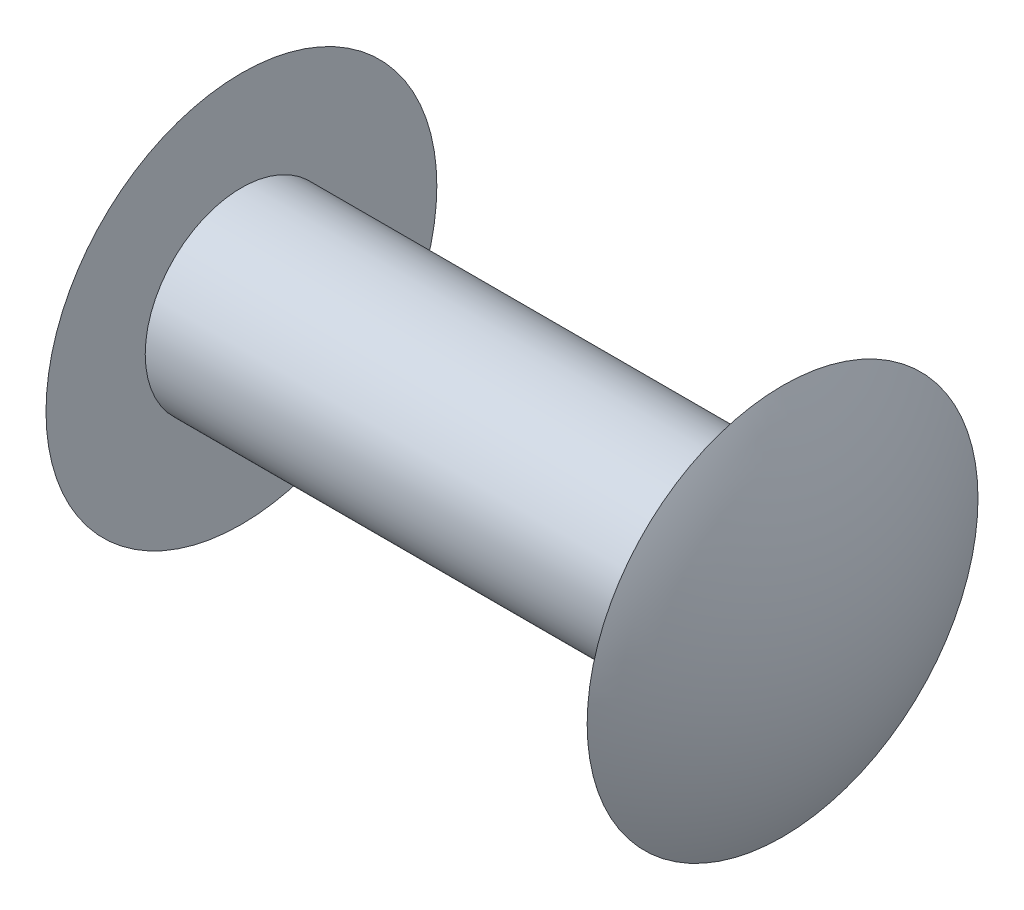
ISO-10303-21;
HEADER;
FILE_DESCRIPTION(('STEP AP214'),'2;1');
FILE_NAME('part.step','',(''),(''),'','','');
FILE_SCHEMA(('AUTOMOTIVE_DESIGN { 1 0 10303 214 1 1 1 1 }'));
ENDSEC;
DATA;
#1=APPLICATION_CONTEXT('core data for automotive mechanical design processes');
#2=APPLICATION_PROTOCOL_DEFINITION('international standard','automotive_design',2000,#1);
#3=PRODUCT_CONTEXT('',#1,'mechanical');
#4=PRODUCT('Part','Part','',(#3));
#5=PRODUCT_RELATED_PRODUCT_CATEGORY('part','',(#4));
#6=PRODUCT_DEFINITION_FORMATION('','',#4);
#7=PRODUCT_DEFINITION_CONTEXT('part definition',#1,'design');
#8=PRODUCT_DEFINITION('design','',#6,#7);
#9=PRODUCT_DEFINITION_SHAPE('','',#8);
#10=(LENGTH_UNIT() NAMED_UNIT(*) SI_UNIT(.MILLI.,.METRE.));
#11=(NAMED_UNIT(*) PLANE_ANGLE_UNIT() SI_UNIT($,.RADIAN.));
#12=(NAMED_UNIT(*) SI_UNIT($,.STERADIAN.) SOLID_ANGLE_UNIT());
#13=UNCERTAINTY_MEASURE_WITH_UNIT(LENGTH_MEASURE(1.E-05),#10,'distance_accuracy_value','');
#14=(GEOMETRIC_REPRESENTATION_CONTEXT(3) GLOBAL_UNCERTAINTY_ASSIGNED_CONTEXT((#13)) GLOBAL_UNIT_ASSIGNED_CONTEXT((#10,
#11,#12)) REPRESENTATION_CONTEXT('',''));
#15=CARTESIAN_POINT('',(0.,0.,0.));
#16=DIRECTION('',(0.,0.,1.));
#17=DIRECTION('',(1.,0.,0.));
#18=AXIS2_PLACEMENT_3D('',#15,#16,#17);
#19=CARTESIAN_POINT('',(6.2015625,0.,0.));
#20=DIRECTION('',(1.,0.,0.));
#21=DIRECTION('',(0.,1.,0.));
#22=AXIS2_PLACEMENT_3D('',#19,#20,#21);
#23=SPHERICAL_SURFACE('',#22,7.0015625);
#24=CARTESIAN_POINT('',(0.,0.,0.));
#25=DIRECTION('',(1.,0.,0.));
#26=DIRECTION('',(0.,0.,-1.));
#27=AXIS2_PLACEMENT_3D('',#24,#25,#26);
#28=CIRCLE('',#27,3.25);
#29=CARTESIAN_POINT('',(0.,0.,-3.25));
#30=VERTEX_POINT('',#29);
#31=EDGE_CURVE('E45',#30,#30,#28,.T.);
#32=ORIENTED_EDGE('',*,*,#31,.F.);
#33=EDGE_LOOP('',(#32));
#34=FACE_BOUND('',#33,.T.);
#35=ADVANCED_FACE('F31',(#34),#23,.T.);
#36=CARTESIAN_POINT('',(2.7984375,0.,0.));
#37=DIRECTION('',(1.,0.,0.));
#38=DIRECTION('',(0.,1.,0.));
#39=AXIS2_PLACEMENT_3D('',#36,#37,#38);
#40=SPHERICAL_SURFACE('',#39,7.0015625);
#41=CARTESIAN_POINT('',(9.,0.,0.));
#42=DIRECTION('',(1.,0.,0.));
#43=DIRECTION('',(0.,0.,-1.));
#44=AXIS2_PLACEMENT_3D('',#41,#42,#43);
#45=CIRCLE('',#44,3.25);
#46=CARTESIAN_POINT('',(9.,0.,-3.25));
#47=VERTEX_POINT('',#46);
#48=EDGE_CURVE('E10',#47,#47,#45,.T.);
#49=ORIENTED_EDGE('',*,*,#48,.T.);
#50=EDGE_LOOP('',(#49));
#51=FACE_BOUND('',#50,.T.);
#52=ADVANCED_FACE('F55',(#51),#40,.T.);
#53=CARTESIAN_POINT('',(9.,1.6,0.));
#54=DIRECTION('',(-1.,0.,0.));
#55=DIRECTION('',(0.,0.,1.));
#56=AXIS2_PLACEMENT_3D('',#53,#54,#55);
#57=PLANE('',#56);
#58=CARTESIAN_POINT('',(9.,0.,0.));
#59=DIRECTION('',(1.,0.,0.));
#60=DIRECTION('',(0.,0.,-1.));
#61=AXIS2_PLACEMENT_3D('',#58,#59,#60);
#62=CIRCLE('',#61,1.6);
#63=CARTESIAN_POINT('',(9.,0.,-1.6));
#64=VERTEX_POINT('',#63);
#65=EDGE_CURVE('E37',#64,#64,#62,.T.);
#66=ORIENTED_EDGE('',*,*,#65,.T.);
#67=EDGE_LOOP('',(#66));
#68=FACE_BOUND('',#67,.T.);
#69=ORIENTED_EDGE('',*,*,#48,.F.);
#70=EDGE_LOOP('',(#69));
#71=FACE_BOUND('',#70,.T.);
#72=ADVANCED_FACE('F59',(#68,#71),#57,.T.);
#73=CARTESIAN_POINT('',(8.75351205606074,0.,0.));
#74=DIRECTION('',(1.,0.,0.));
#75=DIRECTION('',(0.,0.,-1.));
#76=AXIS2_PLACEMENT_3D('',#73,#74,#75);
#77=CYLINDRICAL_SURFACE('',#76,1.6);
#78=CARTESIAN_POINT('',(0.,0.,0.));
#79=DIRECTION('',(1.,0.,0.));
#80=DIRECTION('',(0.,0.,-1.));
#81=AXIS2_PLACEMENT_3D('',#78,#79,#80);
#82=CIRCLE('',#81,1.6);
#83=CARTESIAN_POINT('',(0.,0.,-1.6));
#84=VERTEX_POINT('',#83);
#85=EDGE_CURVE('E41',#84,#84,#82,.T.);
#86=ORIENTED_EDGE('',*,*,#85,.T.);
#87=EDGE_LOOP('',(#86));
#88=FACE_BOUND('',#87,.T.);
#89=ORIENTED_EDGE('',*,*,#65,.F.);
#90=EDGE_LOOP('',(#89));
#91=FACE_BOUND('',#90,.T.);
#92=ADVANCED_FACE('F63',(#88,#91),#77,.T.);
#93=CARTESIAN_POINT('',(0.,3.25,0.));
#94=DIRECTION('',(1.,0.,0.));
#95=DIRECTION('',(0.,0.,-1.));
#96=AXIS2_PLACEMENT_3D('',#93,#94,#95);
#97=PLANE('',#96);
#98=ORIENTED_EDGE('',*,*,#31,.T.);
#99=EDGE_LOOP('',(#98));
#100=FACE_BOUND('',#99,.T.);
#101=ORIENTED_EDGE('',*,*,#85,.F.);
#102=EDGE_LOOP('',(#101));
#103=FACE_BOUND('',#102,.T.);
#104=ADVANCED_FACE('F51',(#100,#103),#97,.T.);
#105=CLOSED_SHELL('',(#35,#52,#72,#92,#104));
#106=MANIFOLD_SOLID_BREP('B2',#105);
#107=ADVANCED_BREP_SHAPE_REPRESENTATION('',(#18,#106),#14);
#108=SHAPE_DEFINITION_REPRESENTATION(#9,#107);
ENDSEC;
END-ISO-10303-21;
